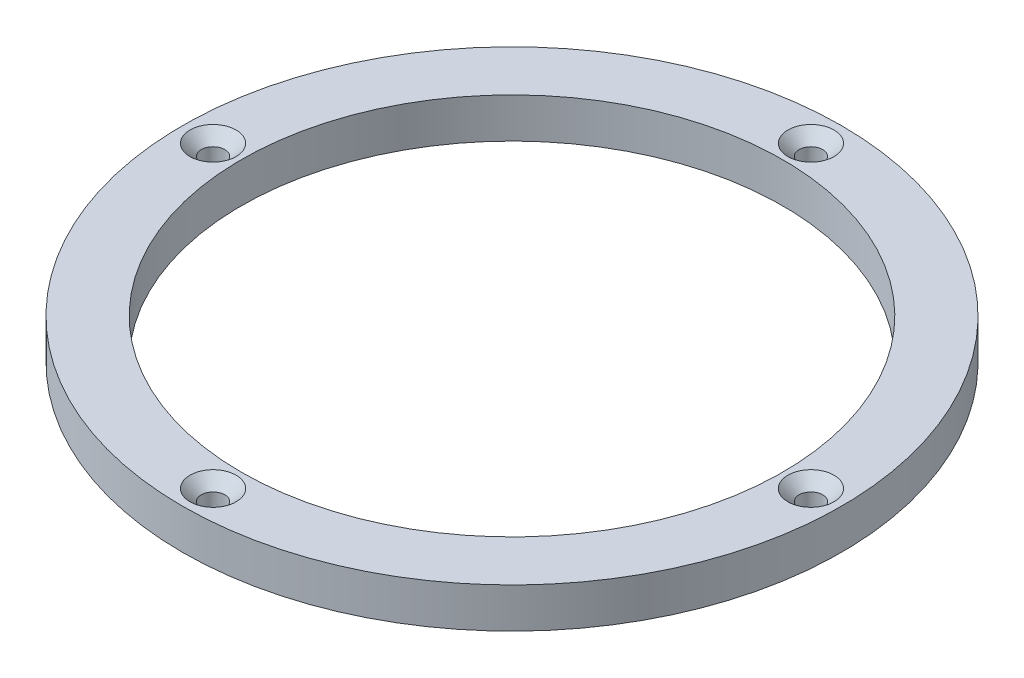
ISO-10303-21;
HEADER;
FILE_DESCRIPTION(('STEP AP214'),'2;1');
FILE_NAME('part.step','',(''),(''),'','','');
FILE_SCHEMA(('AUTOMOTIVE_DESIGN { 1 0 10303 214 1 1 1 1 }'));
ENDSEC;
DATA;
#1=APPLICATION_CONTEXT('core data for automotive mechanical design processes');
#2=APPLICATION_PROTOCOL_DEFINITION('international standard','automotive_design',2000,#1);
#3=PRODUCT_CONTEXT('',#1,'mechanical');
#4=PRODUCT('Part','Part','',(#3));
#5=PRODUCT_RELATED_PRODUCT_CATEGORY('part','',(#4));
#6=PRODUCT_DEFINITION_FORMATION('','',#4);
#7=PRODUCT_DEFINITION_CONTEXT('part definition',#1,'design');
#8=PRODUCT_DEFINITION('design','',#6,#7);
#9=PRODUCT_DEFINITION_SHAPE('','',#8);
#10=(LENGTH_UNIT() NAMED_UNIT(*) SI_UNIT(.MILLI.,.METRE.));
#11=(NAMED_UNIT(*) PLANE_ANGLE_UNIT() SI_UNIT($,.RADIAN.));
#12=(NAMED_UNIT(*) SI_UNIT($,.STERADIAN.) SOLID_ANGLE_UNIT());
#13=UNCERTAINTY_MEASURE_WITH_UNIT(LENGTH_MEASURE(1.E-05),#10,'distance_accuracy_value','');
#14=(GEOMETRIC_REPRESENTATION_CONTEXT(3) GLOBAL_UNCERTAINTY_ASSIGNED_CONTEXT((#13)) GLOBAL_UNIT_ASSIGNED_CONTEXT((#10,
#11,#12)) REPRESENTATION_CONTEXT('',''));
#15=CARTESIAN_POINT('',(0.,0.,0.));
#16=DIRECTION('',(0.,0.,1.));
#17=DIRECTION('',(1.,0.,0.));
#18=AXIS2_PLACEMENT_3D('',#15,#16,#17);
#19=CARTESIAN_POINT('',(0.,8.5,0.));
#20=DIRECTION('',(0.,-1.,0.));
#21=DIRECTION('',(0.,0.,-1.));
#22=AXIS2_PLACEMENT_3D('',#19,#20,#21);
#23=CYLINDRICAL_SURFACE('',#22,57.5);
#24=CARTESIAN_POINT('',(0.,8.5,0.));
#25=DIRECTION('',(0.,1.,0.));
#26=DIRECTION('',(0.,0.,1.));
#27=AXIS2_PLACEMENT_3D('',#24,#25,#26);
#28=CIRCLE('',#27,57.5);
#29=CARTESIAN_POINT('',(0.,8.5,57.5));
#30=VERTEX_POINT('',#29);
#31=EDGE_CURVE('E53',#30,#30,#28,.T.);
#32=ORIENTED_EDGE('',*,*,#31,.T.);
#33=EDGE_LOOP('',(#32));
#34=FACE_BOUND('',#33,.T.);
#35=CARTESIAN_POINT('',(0.,0.,0.));
#36=DIRECTION('',(0.,1.,0.));
#37=DIRECTION('',(0.,0.,1.));
#38=AXIS2_PLACEMENT_3D('',#35,#36,#37);
#39=CIRCLE('',#38,57.5);
#40=CARTESIAN_POINT('',(0.,0.,57.5));
#41=VERTEX_POINT('',#40);
#42=EDGE_CURVE('E78',#41,#41,#39,.T.);
#43=ORIENTED_EDGE('',*,*,#42,.F.);
#44=EDGE_LOOP('',(#43));
#45=FACE_BOUND('',#44,.T.);
#46=ADVANCED_FACE('F44',(#34,#45),#23,.F.);
#47=CARTESIAN_POINT('',(0.,8.5,-63.5));
#48=DIRECTION('',(0.,-1.,0.));
#49=DIRECTION('',(0.,0.,-1.));
#50=AXIS2_PLACEMENT_3D('',#47,#48,#49);
#51=CYLINDRICAL_SURFACE('',#50,2.5);
#52=CARTESIAN_POINT('',(0.,6.10000000000002,-63.5));
#53=DIRECTION('',(0.,1.,0.));
#54=DIRECTION('',(0.,0.,1.));
#55=AXIS2_PLACEMENT_3D('',#52,#53,#54);
#56=CIRCLE('',#55,2.5);
#57=CARTESIAN_POINT('',(0.,6.10000000000002,-61.));
#58=VERTEX_POINT('',#57);
#59=EDGE_CURVE('E67',#58,#58,#56,.F.);
#60=ORIENTED_EDGE('',*,*,#59,.F.);
#61=EDGE_LOOP('',(#60));
#62=FACE_BOUND('',#61,.T.);
#63=CARTESIAN_POINT('',(0.,0.,-63.5));
#64=DIRECTION('',(0.,1.,0.));
#65=DIRECTION('',(0.,0.,1.));
#66=AXIS2_PLACEMENT_3D('',#63,#64,#65);
#67=CIRCLE('',#66,2.5);
#68=CARTESIAN_POINT('',(0.,0.,-61.));
#69=VERTEX_POINT('',#68);
#70=EDGE_CURVE('E75',#69,#69,#67,.T.);
#71=ORIENTED_EDGE('',*,*,#70,.F.);
#72=EDGE_LOOP('',(#71));
#73=FACE_BOUND('',#72,.T.);
#74=ADVANCED_FACE('F109',(#62,#73),#51,.F.);
#75=CARTESIAN_POINT('',(63.5,8.5,2.21709065016539E-13));
#76=DIRECTION('',(0.,-1.,0.));
#77=DIRECTION('',(0.,0.,-1.));
#78=AXIS2_PLACEMENT_3D('',#75,#76,#77);
#79=CYLINDRICAL_SURFACE('',#78,2.5);
#80=CARTESIAN_POINT('',(63.5,6.10000000000002,-6.65127195049617E-13));
#81=DIRECTION('',(0.,1.,0.));
#82=DIRECTION('',(0.,0.,1.));
#83=AXIS2_PLACEMENT_3D('',#80,#81,#82);
#84=CIRCLE('',#83,2.5);
#85=CARTESIAN_POINT('',(63.5,6.10000000000002,2.49999999999933));
#86=VERTEX_POINT('',#85);
#87=EDGE_CURVE('E150',#86,#86,#84,.F.);
#88=ORIENTED_EDGE('',*,*,#87,.F.);
#89=EDGE_LOOP('',(#88));
#90=FACE_BOUND('',#89,.T.);
#91=CARTESIAN_POINT('',(63.5,0.,2.21709065016539E-13));
#92=DIRECTION('',(0.,1.,0.));
#93=DIRECTION('',(0.,0.,1.));
#94=AXIS2_PLACEMENT_3D('',#91,#92,#93);
#95=CIRCLE('',#94,2.5);
#96=CARTESIAN_POINT('',(63.5,0.,2.50000000000022));
#97=VERTEX_POINT('',#96);
#98=EDGE_CURVE('E71',#97,#97,#95,.T.);
#99=ORIENTED_EDGE('',*,*,#98,.F.);
#100=EDGE_LOOP('',(#99));
#101=FACE_BOUND('',#100,.T.);
#102=ADVANCED_FACE('F114',(#90,#101),#79,.F.);
#103=CARTESIAN_POINT('',(-4.43418130033078E-13,8.5,63.5));
#104=DIRECTION('',(0.,-1.,0.));
#105=DIRECTION('',(0.,0.,-1.));
#106=AXIS2_PLACEMENT_3D('',#103,#104,#105);
#107=CYLINDRICAL_SURFACE('',#106,2.5);
#108=CARTESIAN_POINT('',(0.,6.10000000000003,63.5));
#109=DIRECTION('',(0.,1.,0.));
#110=DIRECTION('',(0.,0.,1.));
#111=AXIS2_PLACEMENT_3D('',#108,#109,#110);
#112=CIRCLE('',#111,2.5);
#113=CARTESIAN_POINT('',(0.,6.10000000000003,66.));
#114=VERTEX_POINT('',#113);
#115=EDGE_CURVE('E131',#114,#114,#112,.F.);
#116=ORIENTED_EDGE('',*,*,#115,.F.);
#117=EDGE_LOOP('',(#116));
#118=FACE_BOUND('',#117,.T.);
#119=CARTESIAN_POINT('',(-4.43418130033078E-13,0.,63.5));
#120=DIRECTION('',(0.,1.,0.));
#121=DIRECTION('',(0.,0.,1.));
#122=AXIS2_PLACEMENT_3D('',#119,#120,#121);
#123=CIRCLE('',#122,2.5);
#124=CARTESIAN_POINT('',(-4.43418130033078E-13,0.,66.));
#125=VERTEX_POINT('',#124);
#126=EDGE_CURVE('E66',#125,#125,#123,.T.);
#127=ORIENTED_EDGE('',*,*,#126,.F.);
#128=EDGE_LOOP('',(#127));
#129=FACE_BOUND('',#128,.T.);
#130=ADVANCED_FACE('F120',(#118,#129),#107,.F.);
#131=CARTESIAN_POINT('',(-63.5,8.5,-6.65127195049617E-13));
#132=DIRECTION('',(0.,-1.,0.));
#133=DIRECTION('',(0.,0.,-1.));
#134=AXIS2_PLACEMENT_3D('',#131,#132,#133);
#135=CYLINDRICAL_SURFACE('',#134,2.5);
#136=CARTESIAN_POINT('',(-63.5,6.10000000000002,2.21709065016539E-13));
#137=DIRECTION('',(0.,1.,0.));
#138=DIRECTION('',(0.,0.,1.));
#139=AXIS2_PLACEMENT_3D('',#136,#137,#138);
#140=CIRCLE('',#139,2.5);
#141=CARTESIAN_POINT('',(-63.5,6.10000000000002,2.50000000000022));
#142=VERTEX_POINT('',#141);
#143=EDGE_CURVE('E147',#142,#142,#140,.F.);
#144=ORIENTED_EDGE('',*,*,#143,.F.);
#145=EDGE_LOOP('',(#144));
#146=FACE_BOUND('',#145,.T.);
#147=CARTESIAN_POINT('',(-63.5,0.,-6.65127195049617E-13));
#148=DIRECTION('',(0.,1.,0.));
#149=DIRECTION('',(0.,0.,1.));
#150=AXIS2_PLACEMENT_3D('',#147,#148,#149);
#151=CIRCLE('',#150,2.5);
#152=CARTESIAN_POINT('',(-63.5,0.,2.49999999999933));
#153=VERTEX_POINT('',#152);
#154=EDGE_CURVE('E62',#153,#153,#151,.T.);
#155=ORIENTED_EDGE('',*,*,#154,.F.);
#156=EDGE_LOOP('',(#155));
#157=FACE_BOUND('',#156,.T.);
#158=ADVANCED_FACE('F46',(#146,#157),#135,.F.);
#159=CARTESIAN_POINT('',(0.,8.5,0.));
#160=DIRECTION('',(0.,-1.,0.));
#161=DIRECTION('',(0.,0.,-1.));
#162=AXIS2_PLACEMENT_3D('',#159,#160,#161);
#163=CYLINDRICAL_SURFACE('',#162,70.);
#164=CARTESIAN_POINT('',(0.,8.5,0.));
#165=DIRECTION('',(0.,1.,0.));
#166=DIRECTION('',(0.,0.,1.));
#167=AXIS2_PLACEMENT_3D('',#164,#165,#166);
#168=CIRCLE('',#167,70.);
#169=CARTESIAN_POINT('',(0.,8.5,70.));
#170=VERTEX_POINT('',#169);
#171=EDGE_CURVE('E10',#170,#170,#168,.T.);
#172=ORIENTED_EDGE('',*,*,#171,.F.);
#173=EDGE_LOOP('',(#172));
#174=FACE_BOUND('',#173,.T.);
#175=CARTESIAN_POINT('',(0.,0.,0.));
#176=DIRECTION('',(0.,1.,0.));
#177=DIRECTION('',(0.,0.,1.));
#178=AXIS2_PLACEMENT_3D('',#175,#176,#177);
#179=CIRCLE('',#178,70.);
#180=CARTESIAN_POINT('',(0.,0.,70.));
#181=VERTEX_POINT('',#180);
#182=EDGE_CURVE('E48',#181,#181,#179,.T.);
#183=ORIENTED_EDGE('',*,*,#182,.T.);
#184=EDGE_LOOP('',(#183));
#185=FACE_BOUND('',#184,.T.);
#186=ADVANCED_FACE('F87',(#174,#185),#163,.T.);
#187=CARTESIAN_POINT('',(0.,8.5,0.));
#188=DIRECTION('',(0.,1.,0.));
#189=DIRECTION('',(0.,0.,1.));
#190=AXIS2_PLACEMENT_3D('',#187,#188,#189);
#191=PLANE('',#190);
#192=CARTESIAN_POINT('',(63.5,8.5,-6.65127195049617E-13));
#193=DIRECTION('',(0.,-1.,0.));
#194=DIRECTION('',(1.,0.,0.));
#195=AXIS2_PLACEMENT_3D('',#192,#193,#194);
#196=CIRCLE('',#195,4.9);
#197=CARTESIAN_POINT('',(68.4,8.5,-7.16451970730611E-13));
#198=VERTEX_POINT('',#197);
#199=EDGE_CURVE('E193',#198,#198,#196,.T.);
#200=ORIENTED_EDGE('',*,*,#199,.T.);
#201=EDGE_LOOP('',(#200));
#202=FACE_BOUND('',#201,.T.);
#203=CARTESIAN_POINT('',(0.,8.5,63.5));
#204=DIRECTION('',(0.,-1.,0.));
#205=DIRECTION('',(0.,0.,1.));
#206=AXIS2_PLACEMENT_3D('',#203,#204,#205);
#207=CIRCLE('',#206,4.9);
#208=CARTESIAN_POINT('',(0.,8.5,68.4));
#209=VERTEX_POINT('',#208);
#210=EDGE_CURVE('E142',#209,#209,#207,.T.);
#211=ORIENTED_EDGE('',*,*,#210,.T.);
#212=EDGE_LOOP('',(#211));
#213=FACE_BOUND('',#212,.T.);
#214=CARTESIAN_POINT('',(-63.5,8.5,2.21709065016539E-13));
#215=DIRECTION('',(0.,-1.,0.));
#216=DIRECTION('',(-1.,0.,0.));
#217=AXIS2_PLACEMENT_3D('',#214,#215,#216);
#218=CIRCLE('',#217,4.9);
#219=CARTESIAN_POINT('',(-68.4,8.5,2.3881732357687E-13));
#220=VERTEX_POINT('',#219);
#221=EDGE_CURVE('E141',#220,#220,#218,.T.);
#222=ORIENTED_EDGE('',*,*,#221,.T.);
#223=EDGE_LOOP('',(#222));
#224=FACE_BOUND('',#223,.T.);
#225=CARTESIAN_POINT('',(0.,8.5,-63.5));
#226=DIRECTION('',(0.,-1.,0.));
#227=DIRECTION('',(0.,0.,-1.));
#228=AXIS2_PLACEMENT_3D('',#225,#226,#227);
#229=CIRCLE('',#228,4.9);
#230=CARTESIAN_POINT('',(0.,8.5,-68.4));
#231=VERTEX_POINT('',#230);
#232=EDGE_CURVE('E157',#231,#231,#229,.T.);
#233=ORIENTED_EDGE('',*,*,#232,.T.);
#234=EDGE_LOOP('',(#233));
#235=FACE_BOUND('',#234,.T.);
#236=ORIENTED_EDGE('',*,*,#31,.F.);
#237=EDGE_LOOP('',(#236));
#238=FACE_BOUND('',#237,.T.);
#239=ORIENTED_EDGE('',*,*,#171,.T.);
#240=EDGE_LOOP('',(#239));
#241=FACE_BOUND('',#240,.T.);
#242=ADVANCED_FACE('F92',(#202,#213,#224,#235,#238,#241),#191,.T.);
#243=CARTESIAN_POINT('',(0.,0.,0.));
#244=DIRECTION('',(0.,1.,0.));
#245=DIRECTION('',(0.,0.,1.));
#246=AXIS2_PLACEMENT_3D('',#243,#244,#245);
#247=PLANE('',#246);
#248=ORIENTED_EDGE('',*,*,#154,.T.);
#249=EDGE_LOOP('',(#248));
#250=FACE_BOUND('',#249,.T.);
#251=ORIENTED_EDGE('',*,*,#126,.T.);
#252=EDGE_LOOP('',(#251));
#253=FACE_BOUND('',#252,.T.);
#254=ORIENTED_EDGE('',*,*,#98,.T.);
#255=EDGE_LOOP('',(#254));
#256=FACE_BOUND('',#255,.T.);
#257=ORIENTED_EDGE('',*,*,#70,.T.);
#258=EDGE_LOOP('',(#257));
#259=FACE_BOUND('',#258,.T.);
#260=ORIENTED_EDGE('',*,*,#42,.T.);
#261=EDGE_LOOP('',(#260));
#262=FACE_BOUND('',#261,.T.);
#263=ORIENTED_EDGE('',*,*,#182,.F.);
#264=EDGE_LOOP('',(#263));
#265=FACE_BOUND('',#264,.T.);
#266=ADVANCED_FACE('F89',(#250,#253,#256,#259,#262,#265),#247,.F.);
#267=CARTESIAN_POINT('',(0.,5.2,-63.5));
#268=DIRECTION('',(0.,1.,0.));
#269=DIRECTION('',(0.,0.,1.));
#270=AXIS2_PLACEMENT_3D('',#267,#268,#269);
#271=CONICAL_SURFACE('',#270,1.59999999999997,0.785398163397453);
#272=ORIENTED_EDGE('',*,*,#59,.T.);
#273=EDGE_LOOP('',(#272));
#274=FACE_BOUND('',#273,.T.);
#275=ORIENTED_EDGE('',*,*,#232,.F.);
#276=EDGE_LOOP('',(#275));
#277=FACE_BOUND('',#276,.T.);
#278=ADVANCED_FACE('F91',(#274,#277),#271,.F.);
#279=CARTESIAN_POINT('',(-63.5,5.2,2.21709065016539E-13));
#280=DIRECTION('',(0.,1.,0.));
#281=DIRECTION('',(1.,0.,0.));
#282=AXIS2_PLACEMENT_3D('',#279,#280,#281);
#283=CONICAL_SURFACE('',#282,1.59999999999997,0.785398163397453);
#284=ORIENTED_EDGE('',*,*,#143,.T.);
#285=EDGE_LOOP('',(#284));
#286=FACE_BOUND('',#285,.T.);
#287=ORIENTED_EDGE('',*,*,#221,.F.);
#288=EDGE_LOOP('',(#287));
#289=FACE_BOUND('',#288,.T.);
#290=ADVANCED_FACE('F100',(#286,#289),#283,.F.);
#291=CARTESIAN_POINT('',(0.,5.2,63.5));
#292=DIRECTION('',(0.,1.,0.));
#293=DIRECTION('',(0.,0.,-1.));
#294=AXIS2_PLACEMENT_3D('',#291,#292,#293);
#295=CONICAL_SURFACE('',#294,1.59999999999997,0.785398163397453);
#296=ORIENTED_EDGE('',*,*,#115,.T.);
#297=EDGE_LOOP('',(#296));
#298=FACE_BOUND('',#297,.T.);
#299=ORIENTED_EDGE('',*,*,#210,.F.);
#300=EDGE_LOOP('',(#299));
#301=FACE_BOUND('',#300,.T.);
#302=ADVANCED_FACE('F174',(#298,#301),#295,.F.);
#303=CARTESIAN_POINT('',(63.5,5.2,-6.65127195049617E-13));
#304=DIRECTION('',(0.,1.,0.));
#305=DIRECTION('',(-1.,0.,0.));
#306=AXIS2_PLACEMENT_3D('',#303,#304,#305);
#307=CONICAL_SURFACE('',#306,1.59999999999997,0.785398163397453);
#308=ORIENTED_EDGE('',*,*,#87,.T.);
#309=EDGE_LOOP('',(#308));
#310=FACE_BOUND('',#309,.T.);
#311=ORIENTED_EDGE('',*,*,#199,.F.);
#312=EDGE_LOOP('',(#311));
#313=FACE_BOUND('',#312,.T.);
#314=ADVANCED_FACE('F181',(#310,#313),#307,.F.);
#315=CLOSED_SHELL('',(#46,#74,#102,#130,#158,#186,#242,#266,#278,#290,#302,#314));
#316=MANIFOLD_SOLID_BREP('B2',#315);
#317=ADVANCED_BREP_SHAPE_REPRESENTATION('',(#18,#316),#14);
#318=SHAPE_DEFINITION_REPRESENTATION(#9,#317);
ENDSEC;
END-ISO-10303-21;
